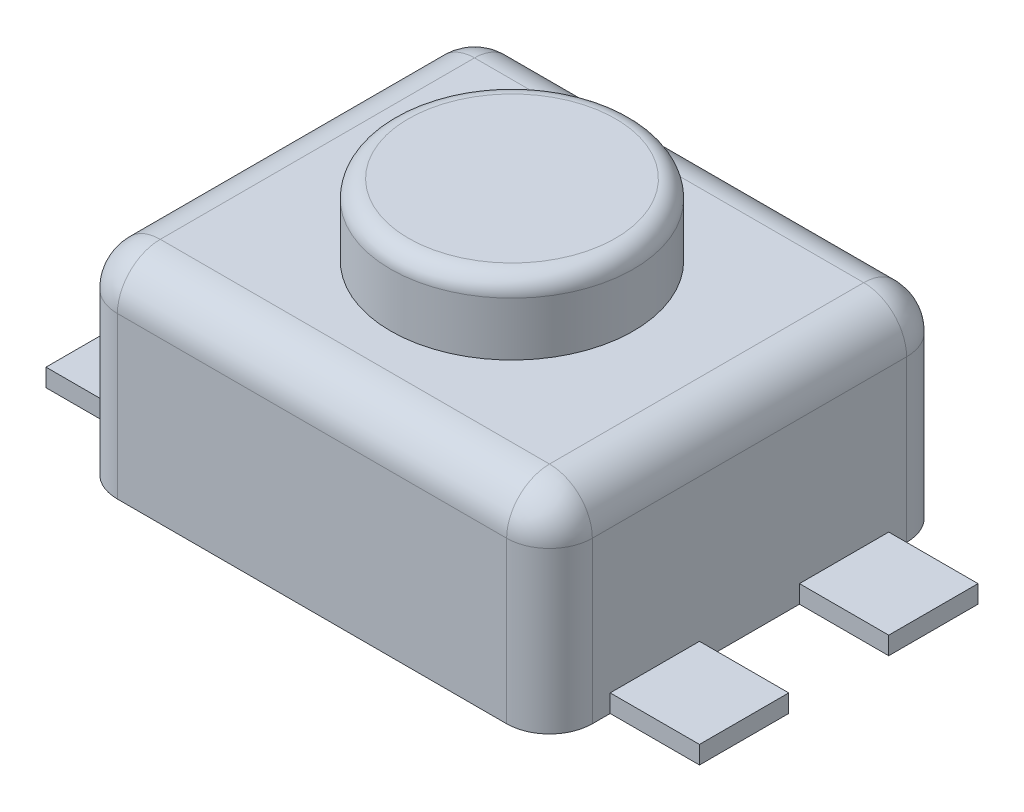
ISO-10303-21;
HEADER;
FILE_DESCRIPTION(('STEP AP214'),'2;1');
FILE_NAME('part.step','',(''),(''),'','','');
FILE_SCHEMA(('AUTOMOTIVE_DESIGN { 1 0 10303 214 1 1 1 1 }'));
ENDSEC;
DATA;
#1=APPLICATION_CONTEXT('core data for automotive mechanical design processes');
#2=APPLICATION_PROTOCOL_DEFINITION('international standard','automotive_design',2000,#1);
#3=PRODUCT_CONTEXT('',#1,'mechanical');
#4=PRODUCT('Part','Part','',(#3));
#5=PRODUCT_RELATED_PRODUCT_CATEGORY('part','',(#4));
#6=PRODUCT_DEFINITION_FORMATION('','',#4);
#7=PRODUCT_DEFINITION_CONTEXT('part definition',#1,'design');
#8=PRODUCT_DEFINITION('design','',#6,#7);
#9=PRODUCT_DEFINITION_SHAPE('','',#8);
#10=(LENGTH_UNIT() NAMED_UNIT(*) SI_UNIT(.MILLI.,.METRE.));
#11=(NAMED_UNIT(*) PLANE_ANGLE_UNIT() SI_UNIT($,.RADIAN.));
#12=(NAMED_UNIT(*) SI_UNIT($,.STERADIAN.) SOLID_ANGLE_UNIT());
#13=UNCERTAINTY_MEASURE_WITH_UNIT(LENGTH_MEASURE(1.E-05),#10,'distance_accuracy_value','');
#14=(GEOMETRIC_REPRESENTATION_CONTEXT(3) GLOBAL_UNCERTAINTY_ASSIGNED_CONTEXT((#13)) GLOBAL_UNIT_ASSIGNED_CONTEXT((#10,
#11,#12)) REPRESENTATION_CONTEXT('',''));
#15=CARTESIAN_POINT('',(0.,0.,0.));
#16=DIRECTION('',(0.,0.,1.));
#17=DIRECTION('',(1.,0.,0.));
#18=AXIS2_PLACEMENT_3D('',#15,#16,#17);
#19=CARTESIAN_POINT('',(-1.6891,1.4478,-1.4224));
#20=DIRECTION('',(1.,0.,0.));
#21=DIRECTION('',(0.,0.,-1.));
#22=AXIS2_PLACEMENT_3D('',#19,#20,#21);
#23=PLANE('',#22);
#24=DIRECTION('',(0.,-1.,0.));
#25=VECTOR('',#24,1.);
#26=CARTESIAN_POINT('',(-1.6891,0.127,0.3556));
#27=LINE('',#26,#25);
#28=CARTESIAN_POINT('',(-1.6891,0.127,0.3556));
#29=VERTEX_POINT('',#28);
#30=CARTESIAN_POINT('',(-1.6891,0.,0.3556));
#31=VERTEX_POINT('',#30);
#32=EDGE_CURVE('E298',#29,#31,#27,.T.);
#33=ORIENTED_EDGE('',*,*,#32,.F.);
#34=DIRECTION('',(0.,0.,-1.));
#35=VECTOR('',#34,1.);
#36=CARTESIAN_POINT('',(-1.6891,0.127,0.9906));
#37=LINE('',#36,#35);
#38=CARTESIAN_POINT('',(-1.6891,0.127,0.9906));
#39=VERTEX_POINT('',#38);
#40=EDGE_CURVE('E273',#39,#29,#37,.T.);
#41=ORIENTED_EDGE('',*,*,#40,.F.);
#42=DIRECTION('',(0.,-1.,0.));
#43=VECTOR('',#42,1.);
#44=CARTESIAN_POINT('',(-1.6891,0.127,0.9906));
#45=LINE('',#44,#43);
#46=CARTESIAN_POINT('',(-1.6891,0.,0.9906));
#47=VERTEX_POINT('',#46);
#48=EDGE_CURVE('E284',#39,#47,#45,.T.);
#49=ORIENTED_EDGE('',*,*,#48,.T.);
#50=DIRECTION('',(0.,0.,1.));
#51=VECTOR('',#50,1.);
#52=CARTESIAN_POINT('',(-1.6891,0.,-1.4224));
#53=LINE('',#52,#51);
#54=CARTESIAN_POINT('',(-1.6891,0.,1.1176));
#55=VERTEX_POINT('',#54);
#56=EDGE_CURVE('E341',#47,#55,#53,.T.);
#57=ORIENTED_EDGE('',*,*,#56,.T.);
#58=DIRECTION('',(0.,-1.,0.));
#59=VECTOR('',#58,1.);
#60=CARTESIAN_POINT('',(-1.6891,1.4478,1.1176));
#61=LINE('',#60,#59);
#62=CARTESIAN_POINT('',(-1.6891,1.143,1.1176));
#63=VERTEX_POINT('',#62);
#64=EDGE_CURVE('E368',#55,#63,#61,.F.);
#65=ORIENTED_EDGE('',*,*,#64,.T.);
#66=DIRECTION('',(0.,0.,1.));
#67=VECTOR('',#66,1.);
#68=CARTESIAN_POINT('',(-1.6891,1.143,-1.4224));
#69=LINE('',#68,#67);
#70=CARTESIAN_POINT('',(-1.6891,1.143,-1.1176));
#71=VERTEX_POINT('',#70);
#72=EDGE_CURVE('E366',#63,#71,#69,.F.);
#73=ORIENTED_EDGE('',*,*,#72,.T.);
#74=DIRECTION('',(0.,-1.,0.));
#75=VECTOR('',#74,1.);
#76=CARTESIAN_POINT('',(-1.6891,1.4478,-1.1176));
#77=LINE('',#76,#75);
#78=CARTESIAN_POINT('',(-1.6891,0.,-1.1176));
#79=VERTEX_POINT('',#78);
#80=EDGE_CURVE('E364',#71,#79,#77,.T.);
#81=ORIENTED_EDGE('',*,*,#80,.T.);
#82=CARTESIAN_POINT('',(-1.6891,0.,-0.9906));
#83=VERTEX_POINT('',#82);
#84=EDGE_CURVE('E342',#79,#83,#53,.T.);
#85=ORIENTED_EDGE('',*,*,#84,.T.);
#86=DIRECTION('',(0.,-1.,0.));
#87=VECTOR('',#86,1.);
#88=CARTESIAN_POINT('',(-1.6891,0.127,-0.9906));
#89=LINE('',#88,#87);
#90=CARTESIAN_POINT('',(-1.6891,0.127,-0.9906));
#91=VERTEX_POINT('',#90);
#92=EDGE_CURVE('E327',#91,#83,#89,.T.);
#93=ORIENTED_EDGE('',*,*,#92,.F.);
#94=DIRECTION('',(0.,0.,-1.));
#95=VECTOR('',#94,1.);
#96=CARTESIAN_POINT('',(-1.6891,0.127,-0.3556));
#97=LINE('',#96,#95);
#98=CARTESIAN_POINT('',(-1.6891,0.127,-0.3556));
#99=VERTEX_POINT('',#98);
#100=EDGE_CURVE('E302',#99,#91,#97,.T.);
#101=ORIENTED_EDGE('',*,*,#100,.F.);
#102=DIRECTION('',(0.,-1.,0.));
#103=VECTOR('',#102,1.);
#104=CARTESIAN_POINT('',(-1.6891,0.127,-0.3556));
#105=LINE('',#104,#103);
#106=CARTESIAN_POINT('',(-1.6891,0.,-0.3556));
#107=VERTEX_POINT('',#106);
#108=EDGE_CURVE('E313',#99,#107,#105,.T.);
#109=ORIENTED_EDGE('',*,*,#108,.T.);
#110=EDGE_CURVE('E345',#107,#31,#53,.T.);
#111=ORIENTED_EDGE('',*,*,#110,.T.);
#112=EDGE_LOOP('',(#33,#41,#49,#57,#65,#73,#81,#85,#93,#101,#109,#111));
#113=FACE_BOUND('',#112,.T.);
#114=ADVANCED_FACE('F35',(#113),#23,.F.);
#115=CARTESIAN_POINT('',(1.6891,1.4478,-1.4224));
#116=DIRECTION('',(-1.,0.,0.));
#117=DIRECTION('',(0.,0.,1.));
#118=AXIS2_PLACEMENT_3D('',#115,#116,#117);
#119=PLANE('',#118);
#120=DIRECTION('',(0.,0.,-1.));
#121=VECTOR('',#120,1.);
#122=CARTESIAN_POINT('',(1.6891,0.,-1.4224));
#123=LINE('',#122,#121);
#124=CARTESIAN_POINT('',(1.6891,0.,1.1176));
#125=VERTEX_POINT('',#124);
#126=CARTESIAN_POINT('',(1.6891,0.,0.9906));
#127=VERTEX_POINT('',#126);
#128=EDGE_CURVE('E334',#125,#127,#123,.T.);
#129=ORIENTED_EDGE('',*,*,#128,.T.);
#130=DIRECTION('',(0.,-1.,0.));
#131=VECTOR('',#130,1.);
#132=CARTESIAN_POINT('',(1.6891,0.127,0.9906));
#133=LINE('',#132,#131);
#134=CARTESIAN_POINT('',(1.6891,0.127,0.9906));
#135=VERTEX_POINT('',#134);
#136=EDGE_CURVE('E55',#135,#127,#133,.T.);
#137=ORIENTED_EDGE('',*,*,#136,.F.);
#138=DIRECTION('',(0.,0.,-1.));
#139=VECTOR('',#138,1.);
#140=CARTESIAN_POINT('',(1.6891,0.127,0.9906));
#141=LINE('',#140,#139);
#142=CARTESIAN_POINT('',(1.6891,0.127,0.3556));
#143=VERTEX_POINT('',#142);
#144=EDGE_CURVE('E50',#135,#143,#141,.T.);
#145=ORIENTED_EDGE('',*,*,#144,.T.);
#146=DIRECTION('',(0.,-1.,0.));
#147=VECTOR('',#146,1.);
#148=CARTESIAN_POINT('',(1.6891,0.127,0.3556));
#149=LINE('',#148,#147);
#150=CARTESIAN_POINT('',(1.6891,0.,0.3556));
#151=VERTEX_POINT('',#150);
#152=EDGE_CURVE('E229',#143,#151,#149,.T.);
#153=ORIENTED_EDGE('',*,*,#152,.T.);
#154=CARTESIAN_POINT('',(1.6891,0.,-0.3556));
#155=VERTEX_POINT('',#154);
#156=EDGE_CURVE('E337',#151,#155,#123,.T.);
#157=ORIENTED_EDGE('',*,*,#156,.T.);
#158=DIRECTION('',(0.,-1.,0.));
#159=VECTOR('',#158,1.);
#160=CARTESIAN_POINT('',(1.6891,0.127,-0.3556));
#161=LINE('',#160,#159);
#162=CARTESIAN_POINT('',(1.6891,0.127,-0.3556));
#163=VERTEX_POINT('',#162);
#164=EDGE_CURVE('E269',#163,#155,#161,.T.);
#165=ORIENTED_EDGE('',*,*,#164,.F.);
#166=DIRECTION('',(0.,0.,-1.));
#167=VECTOR('',#166,1.);
#168=CARTESIAN_POINT('',(1.6891,0.127,-0.3556));
#169=LINE('',#168,#167);
#170=CARTESIAN_POINT('',(1.6891,0.127,-0.9906));
#171=VERTEX_POINT('',#170);
#172=EDGE_CURVE('E243',#163,#171,#169,.T.);
#173=ORIENTED_EDGE('',*,*,#172,.T.);
#174=DIRECTION('',(0.,-1.,0.));
#175=VECTOR('',#174,1.);
#176=CARTESIAN_POINT('',(1.6891,0.127,-0.9906));
#177=LINE('',#176,#175);
#178=CARTESIAN_POINT('',(1.6891,0.,-0.9906));
#179=VERTEX_POINT('',#178);
#180=EDGE_CURVE('E255',#171,#179,#177,.T.);
#181=ORIENTED_EDGE('',*,*,#180,.T.);
#182=CARTESIAN_POINT('',(1.6891,0.,-1.1176));
#183=VERTEX_POINT('',#182);
#184=EDGE_CURVE('E338',#179,#183,#123,.T.);
#185=ORIENTED_EDGE('',*,*,#184,.T.);
#186=DIRECTION('',(0.,-1.,0.));
#187=VECTOR('',#186,1.);
#188=CARTESIAN_POINT('',(1.6891,1.4478,-1.1176));
#189=LINE('',#188,#187);
#190=CARTESIAN_POINT('',(1.6891,1.143,-1.1176));
#191=VERTEX_POINT('',#190);
#192=EDGE_CURVE('E380',#183,#191,#189,.F.);
#193=ORIENTED_EDGE('',*,*,#192,.T.);
#194=DIRECTION('',(0.,0.,-1.));
#195=VECTOR('',#194,1.);
#196=CARTESIAN_POINT('',(1.6891,1.143,1.4224));
#197=LINE('',#196,#195);
#198=CARTESIAN_POINT('',(1.6891,1.143,1.1176));
#199=VERTEX_POINT('',#198);
#200=EDGE_CURVE('E378',#191,#199,#197,.F.);
#201=ORIENTED_EDGE('',*,*,#200,.T.);
#202=DIRECTION('',(0.,-1.,0.));
#203=VECTOR('',#202,1.);
#204=CARTESIAN_POINT('',(1.6891,1.4478,1.1176));
#205=LINE('',#204,#203);
#206=EDGE_CURVE('E376',#199,#125,#205,.T.);
#207=ORIENTED_EDGE('',*,*,#206,.T.);
#208=EDGE_LOOP('',(#129,#137,#145,#153,#157,#165,#173,#181,#185,#193,#201,#207));
#209=FACE_BOUND('',#208,.T.);
#210=ADVANCED_FACE('F443',(#209),#119,.F.);
#211=CARTESIAN_POINT('',(-1.6891,1.4478,-1.4224));
#212=DIRECTION('',(0.,0.,1.));
#213=DIRECTION('',(1.,0.,0.));
#214=AXIS2_PLACEMENT_3D('',#211,#212,#213);
#215=PLANE('',#214);
#216=DIRECTION('',(-1.,0.,0.));
#217=VECTOR('',#216,1.);
#218=CARTESIAN_POINT('',(-1.6891,0.,-1.4224));
#219=LINE('',#218,#217);
#220=CARTESIAN_POINT('',(1.3843,0.,-1.4224));
#221=VERTEX_POINT('',#220);
#222=CARTESIAN_POINT('',(-1.3843,0.,-1.4224));
#223=VERTEX_POINT('',#222);
#224=EDGE_CURVE('E336',#221,#223,#219,.T.);
#225=ORIENTED_EDGE('',*,*,#224,.T.);
#226=DIRECTION('',(0.,-1.,0.));
#227=VECTOR('',#226,1.);
#228=CARTESIAN_POINT('',(-1.3843,1.4478,-1.4224));
#229=LINE('',#228,#227);
#230=CARTESIAN_POINT('',(-1.3843,1.143,-1.4224));
#231=VERTEX_POINT('',#230);
#232=EDGE_CURVE('E374',#223,#231,#229,.F.);
#233=ORIENTED_EDGE('',*,*,#232,.T.);
#234=DIRECTION('',(-1.,0.,0.));
#235=VECTOR('',#234,1.);
#236=CARTESIAN_POINT('',(1.6891,1.143,-1.4224));
#237=LINE('',#236,#235);
#238=CARTESIAN_POINT('',(1.3843,1.143,-1.4224));
#239=VERTEX_POINT('',#238);
#240=EDGE_CURVE('E372',#231,#239,#237,.F.);
#241=ORIENTED_EDGE('',*,*,#240,.T.);
#242=DIRECTION('',(0.,-1.,0.));
#243=VECTOR('',#242,1.);
#244=CARTESIAN_POINT('',(1.3843,1.4478,-1.4224));
#245=LINE('',#244,#243);
#246=EDGE_CURVE('E370',#239,#221,#245,.T.);
#247=ORIENTED_EDGE('',*,*,#246,.T.);
#248=EDGE_LOOP('',(#225,#233,#241,#247));
#249=FACE_BOUND('',#248,.T.);
#250=ADVANCED_FACE('F449',(#249),#215,.F.);
#251=CARTESIAN_POINT('',(-1.6891,1.4478,1.4224));
#252=DIRECTION('',(0.,0.,-1.));
#253=DIRECTION('',(-1.,0.,0.));
#254=AXIS2_PLACEMENT_3D('',#251,#252,#253);
#255=PLANE('',#254);
#256=DIRECTION('',(1.,0.,0.));
#257=VECTOR('',#256,1.);
#258=CARTESIAN_POINT('',(-1.6891,1.143,1.4224));
#259=LINE('',#258,#257);
#260=CARTESIAN_POINT('',(1.3843,1.143,1.4224));
#261=VERTEX_POINT('',#260);
#262=CARTESIAN_POINT('',(-1.3843,1.143,1.4224));
#263=VERTEX_POINT('',#262);
#264=EDGE_CURVE('E359',#261,#263,#259,.F.);
#265=ORIENTED_EDGE('',*,*,#264,.T.);
#266=DIRECTION('',(0.,-1.,0.));
#267=VECTOR('',#266,1.);
#268=CARTESIAN_POINT('',(-1.3843,1.4478,1.4224));
#269=LINE('',#268,#267);
#270=CARTESIAN_POINT('',(-1.3843,0.,1.4224));
#271=VERTEX_POINT('',#270);
#272=EDGE_CURVE('E362',#263,#271,#269,.T.);
#273=ORIENTED_EDGE('',*,*,#272,.T.);
#274=DIRECTION('',(1.,0.,0.));
#275=VECTOR('',#274,1.);
#276=CARTESIAN_POINT('',(-1.6891,0.,1.4224));
#277=LINE('',#276,#275);
#278=CARTESIAN_POINT('',(1.3843,0.,1.4224));
#279=VERTEX_POINT('',#278);
#280=EDGE_CURVE('E344',#271,#279,#277,.T.);
#281=ORIENTED_EDGE('',*,*,#280,.T.);
#282=DIRECTION('',(0.,-1.,0.));
#283=VECTOR('',#282,1.);
#284=CARTESIAN_POINT('',(1.3843,1.4478,1.4224));
#285=LINE('',#284,#283);
#286=EDGE_CURVE('E357',#279,#261,#285,.F.);
#287=ORIENTED_EDGE('',*,*,#286,.T.);
#288=EDGE_LOOP('',(#265,#273,#281,#287));
#289=FACE_BOUND('',#288,.T.);
#290=ADVANCED_FACE('F453',(#289),#255,.F.);
#291=CARTESIAN_POINT('',(0.,1.4478,0.));
#292=DIRECTION('',(0.,1.,0.));
#293=DIRECTION('',(0.,0.,1.));
#294=AXIS2_PLACEMENT_3D('',#291,#292,#293);
#295=PLANE('',#294);
#296=CARTESIAN_POINT('',(0.,1.4478,0.));
#297=DIRECTION('',(0.,1.,0.));
#298=DIRECTION('',(0.,0.,1.));
#299=AXIS2_PLACEMENT_3D('',#296,#297,#298);
#300=CIRCLE('',#299,0.8636);
#301=CARTESIAN_POINT('',(0.,1.4478,0.8636));
#302=VERTEX_POINT('',#301);
#303=EDGE_CURVE('E330',#302,#302,#300,.T.);
#304=ORIENTED_EDGE('',*,*,#303,.F.);
#305=EDGE_LOOP('',(#304));
#306=FACE_BOUND('',#305,.T.);
#307=DIRECTION('',(0.,0.,1.));
#308=VECTOR('',#307,1.);
#309=CARTESIAN_POINT('',(-1.3843,1.4478,1.4224));
#310=LINE('',#309,#308);
#311=CARTESIAN_POINT('',(-1.3843,1.4478,-1.1176));
#312=VERTEX_POINT('',#311);
#313=CARTESIAN_POINT('',(-1.3843,1.4478,1.1176));
#314=VERTEX_POINT('',#313);
#315=EDGE_CURVE('E352',#312,#314,#310,.T.);
#316=ORIENTED_EDGE('',*,*,#315,.T.);
#317=DIRECTION('',(1.,0.,0.));
#318=VECTOR('',#317,1.);
#319=CARTESIAN_POINT('',(1.6891,1.4478,1.1176));
#320=LINE('',#319,#318);
#321=CARTESIAN_POINT('',(1.3843,1.4478,1.1176));
#322=VERTEX_POINT('',#321);
#323=EDGE_CURVE('E354',#314,#322,#320,.T.);
#324=ORIENTED_EDGE('',*,*,#323,.T.);
#325=DIRECTION('',(0.,0.,-1.));
#326=VECTOR('',#325,1.);
#327=CARTESIAN_POINT('',(1.3843,1.4478,-1.4224));
#328=LINE('',#327,#326);
#329=CARTESIAN_POINT('',(1.3843,1.4478,-1.1176));
#330=VERTEX_POINT('',#329);
#331=EDGE_CURVE('E348',#322,#330,#328,.T.);
#332=ORIENTED_EDGE('',*,*,#331,.T.);
#333=DIRECTION('',(-1.,0.,0.));
#334=VECTOR('',#333,1.);
#335=CARTESIAN_POINT('',(-1.6891,1.4478,-1.1176));
#336=LINE('',#335,#334);
#337=EDGE_CURVE('E350',#330,#312,#336,.T.);
#338=ORIENTED_EDGE('',*,*,#337,.T.);
#339=EDGE_LOOP('',(#316,#324,#332,#338));
#340=FACE_BOUND('',#339,.T.);
#341=ADVANCED_FACE('F508',(#306,#340),#295,.T.);
#342=CARTESIAN_POINT('',(0.,0.,0.));
#343=DIRECTION('',(0.,1.,0.));
#344=DIRECTION('',(0.,0.,1.));
#345=AXIS2_PLACEMENT_3D('',#342,#343,#344);
#346=PLANE('',#345);
#347=ORIENTED_EDGE('',*,*,#280,.F.);
#348=CARTESIAN_POINT('',(-1.3843,0.,1.1176));
#349=DIRECTION('',(0.,1.,0.));
#350=DIRECTION('',(0.,0.,1.));
#351=AXIS2_PLACEMENT_3D('',#348,#349,#350);
#352=CIRCLE('',#351,0.3048);
#353=EDGE_CURVE('E389',#271,#55,#352,.F.);
#354=ORIENTED_EDGE('',*,*,#353,.T.);
#355=ORIENTED_EDGE('',*,*,#56,.F.);
#356=DIRECTION('',(1.,0.,0.));
#357=VECTOR('',#356,1.);
#358=CARTESIAN_POINT('',(-1.6891,0.,0.9906));
#359=LINE('',#358,#357);
#360=CARTESIAN_POINT('',(-2.3241,0.,0.9906));
#361=VERTEX_POINT('',#360);
#362=EDGE_CURVE('E277',#361,#47,#359,.T.);
#363=ORIENTED_EDGE('',*,*,#362,.F.);
#364=DIRECTION('',(0.,0.,1.));
#365=VECTOR('',#364,1.);
#366=CARTESIAN_POINT('',(-2.3241,0.,0.9906));
#367=LINE('',#366,#365);
#368=CARTESIAN_POINT('',(-2.3241,0.,0.3556));
#369=VERTEX_POINT('',#368);
#370=EDGE_CURVE('E286',#369,#361,#367,.T.);
#371=ORIENTED_EDGE('',*,*,#370,.F.);
#372=DIRECTION('',(-1.,0.,0.));
#373=VECTOR('',#372,1.);
#374=CARTESIAN_POINT('',(-1.6891,0.,0.3556));
#375=LINE('',#374,#373);
#376=EDGE_CURVE('E272',#31,#369,#375,.T.);
#377=ORIENTED_EDGE('',*,*,#376,.F.);
#378=ORIENTED_EDGE('',*,*,#110,.F.);
#379=DIRECTION('',(1.,0.,0.));
#380=VECTOR('',#379,1.);
#381=CARTESIAN_POINT('',(-1.6891,0.,-0.3556));
#382=LINE('',#381,#380);
#383=CARTESIAN_POINT('',(-2.3241,0.,-0.3556));
#384=VERTEX_POINT('',#383);
#385=EDGE_CURVE('E306',#384,#107,#382,.T.);
#386=ORIENTED_EDGE('',*,*,#385,.F.);
#387=DIRECTION('',(0.,0.,1.));
#388=VECTOR('',#387,1.);
#389=CARTESIAN_POINT('',(-2.3241,0.,-0.3556));
#390=LINE('',#389,#388);
#391=CARTESIAN_POINT('',(-2.3241,0.,-0.9906));
#392=VERTEX_POINT('',#391);
#393=EDGE_CURVE('E315',#392,#384,#390,.T.);
#394=ORIENTED_EDGE('',*,*,#393,.F.);
#395=DIRECTION('',(-1.,0.,0.));
#396=VECTOR('',#395,1.);
#397=CARTESIAN_POINT('',(-1.6891,0.,-0.9906));
#398=LINE('',#397,#396);
#399=EDGE_CURVE('E301',#83,#392,#398,.T.);
#400=ORIENTED_EDGE('',*,*,#399,.F.);
#401=ORIENTED_EDGE('',*,*,#84,.F.);
#402=CARTESIAN_POINT('',(-1.3843,0.,-1.1176));
#403=DIRECTION('',(0.,1.,0.));
#404=DIRECTION('',(0.,0.,1.));
#405=AXIS2_PLACEMENT_3D('',#402,#403,#404);
#406=CIRCLE('',#405,0.3048);
#407=EDGE_CURVE('E387',#79,#223,#406,.F.);
#408=ORIENTED_EDGE('',*,*,#407,.T.);
#409=ORIENTED_EDGE('',*,*,#224,.F.);
#410=CARTESIAN_POINT('',(1.3843,0.,-1.1176));
#411=DIRECTION('',(0.,1.,0.));
#412=DIRECTION('',(0.,0.,1.));
#413=AXIS2_PLACEMENT_3D('',#410,#411,#412);
#414=CIRCLE('',#413,0.3048);
#415=EDGE_CURVE('E384',#221,#183,#414,.F.);
#416=ORIENTED_EDGE('',*,*,#415,.T.);
#417=ORIENTED_EDGE('',*,*,#184,.F.);
#418=DIRECTION('',(1.,0.,0.));
#419=VECTOR('',#418,1.);
#420=CARTESIAN_POINT('',(1.6891,0.,-0.9906));
#421=LINE('',#420,#419);
#422=CARTESIAN_POINT('',(2.3241,0.,-0.9906));
#423=VERTEX_POINT('',#422);
#424=EDGE_CURVE('E246',#179,#423,#421,.T.);
#425=ORIENTED_EDGE('',*,*,#424,.T.);
#426=DIRECTION('',(0.,0.,1.));
#427=VECTOR('',#426,1.);
#428=CARTESIAN_POINT('',(2.3241,0.,-0.3556));
#429=LINE('',#428,#427);
#430=CARTESIAN_POINT('',(2.3241,0.,-0.3556));
#431=VERTEX_POINT('',#430);
#432=EDGE_CURVE('E258',#423,#431,#429,.T.);
#433=ORIENTED_EDGE('',*,*,#432,.T.);
#434=DIRECTION('',(-1.,0.,0.));
#435=VECTOR('',#434,1.);
#436=CARTESIAN_POINT('',(1.6891,0.,-0.3556));
#437=LINE('',#436,#435);
#438=EDGE_CURVE('E242',#431,#155,#437,.T.);
#439=ORIENTED_EDGE('',*,*,#438,.T.);
#440=ORIENTED_EDGE('',*,*,#156,.F.);
#441=DIRECTION('',(1.,0.,0.));
#442=VECTOR('',#441,1.);
#443=CARTESIAN_POINT('',(1.6891,0.,0.3556));
#444=LINE('',#443,#442);
#445=CARTESIAN_POINT('',(2.3241,0.,0.3556));
#446=VERTEX_POINT('',#445);
#447=EDGE_CURVE('E236',#151,#446,#444,.T.);
#448=ORIENTED_EDGE('',*,*,#447,.T.);
#449=DIRECTION('',(0.,0.,1.));
#450=VECTOR('',#449,1.);
#451=CARTESIAN_POINT('',(2.3241,0.,0.9906));
#452=LINE('',#451,#450);
#453=CARTESIAN_POINT('',(2.3241,0.,0.9906));
#454=VERTEX_POINT('',#453);
#455=EDGE_CURVE('E234',#446,#454,#452,.T.);
#456=ORIENTED_EDGE('',*,*,#455,.T.);
#457=DIRECTION('',(-1.,0.,0.));
#458=VECTOR('',#457,1.);
#459=CARTESIAN_POINT('',(1.6891,0.,0.9906));
#460=LINE('',#459,#458);
#461=EDGE_CURVE('E212',#454,#127,#460,.T.);
#462=ORIENTED_EDGE('',*,*,#461,.T.);
#463=ORIENTED_EDGE('',*,*,#128,.F.);
#464=CARTESIAN_POINT('',(1.3843,0.,1.1176));
#465=DIRECTION('',(0.,1.,0.));
#466=DIRECTION('',(0.,0.,1.));
#467=AXIS2_PLACEMENT_3D('',#464,#465,#466);
#468=CIRCLE('',#467,0.3048);
#469=EDGE_CURVE('E382',#125,#279,#468,.F.);
#470=ORIENTED_EDGE('',*,*,#469,.T.);
#471=EDGE_LOOP('',(#347,#354,#355,#363,#371,#377,#378,#386,#394,#400,#401,#408,#409,#416,#417,
#425,#433,#439,#440,#448,#456,#462,#463,#470));
#472=FACE_BOUND('',#471,.T.);
#473=ADVANCED_FACE('F503',(#472),#346,.F.);
#474=CARTESIAN_POINT('',(-1.3843,1.4478,-1.1176));
#475=DIRECTION('',(0.,-1.,0.));
#476=DIRECTION('',(0.,0.,-1.));
#477=AXIS2_PLACEMENT_3D('',#474,#475,#476);
#478=CYLINDRICAL_SURFACE('',#477,0.3048);
#479=ORIENTED_EDGE('',*,*,#407,.F.);
#480=ORIENTED_EDGE('',*,*,#80,.F.);
#481=CARTESIAN_POINT('',(-1.3843,1.143,-1.1176));
#482=DIRECTION('',(0.,1.,0.));
#483=DIRECTION('',(0.,0.,1.));
#484=AXIS2_PLACEMENT_3D('',#481,#482,#483);
#485=CIRCLE('',#484,0.3048);
#486=EDGE_CURVE('E422',#231,#71,#485,.T.);
#487=ORIENTED_EDGE('',*,*,#486,.F.);
#488=ORIENTED_EDGE('',*,*,#232,.F.);
#489=EDGE_LOOP('',(#479,#480,#487,#488));
#490=FACE_BOUND('',#489,.T.);
#491=ADVANCED_FACE('F500',(#490),#478,.T.);
#492=CARTESIAN_POINT('',(0.,1.143,-1.1176));
#493=DIRECTION('',(1.,0.,0.));
#494=DIRECTION('',(0.,0.,-1.));
#495=AXIS2_PLACEMENT_3D('',#492,#493,#494);
#496=CYLINDRICAL_SURFACE('',#495,0.3048);
#497=CARTESIAN_POINT('',(1.3843,1.143,-1.1176));
#498=DIRECTION('',(1.,0.,0.));
#499=DIRECTION('',(0.,0.,-1.));
#500=AXIS2_PLACEMENT_3D('',#497,#498,#499);
#501=CIRCLE('',#500,0.3048);
#502=EDGE_CURVE('E416',#239,#330,#501,.T.);
#503=ORIENTED_EDGE('',*,*,#502,.F.);
#504=ORIENTED_EDGE('',*,*,#240,.F.);
#505=CARTESIAN_POINT('',(-1.3843,1.143,-1.1176));
#506=DIRECTION('',(-1.,0.,0.));
#507=DIRECTION('',(0.,0.,1.));
#508=AXIS2_PLACEMENT_3D('',#505,#506,#507);
#509=CIRCLE('',#508,0.3048);
#510=EDGE_CURVE('E419',#312,#231,#509,.T.);
#511=ORIENTED_EDGE('',*,*,#510,.F.);
#512=ORIENTED_EDGE('',*,*,#337,.F.);
#513=EDGE_LOOP('',(#503,#504,#511,#512));
#514=FACE_BOUND('',#513,.T.);
#515=ADVANCED_FACE('F497',(#514),#496,.T.);
#516=CARTESIAN_POINT('',(1.3843,1.4478,-1.1176));
#517=DIRECTION('',(0.,-1.,0.));
#518=DIRECTION('',(0.,0.,-1.));
#519=AXIS2_PLACEMENT_3D('',#516,#517,#518);
#520=CYLINDRICAL_SURFACE('',#519,0.3048);
#521=ORIENTED_EDGE('',*,*,#415,.F.);
#522=ORIENTED_EDGE('',*,*,#246,.F.);
#523=CARTESIAN_POINT('',(1.3843,1.143,-1.1176));
#524=DIRECTION('',(0.,1.,0.));
#525=DIRECTION('',(0.,0.,1.));
#526=AXIS2_PLACEMENT_3D('',#523,#524,#525);
#527=CIRCLE('',#526,0.3048);
#528=EDGE_CURVE('E413',#191,#239,#527,.T.);
#529=ORIENTED_EDGE('',*,*,#528,.F.);
#530=ORIENTED_EDGE('',*,*,#192,.F.);
#531=EDGE_LOOP('',(#521,#522,#529,#530));
#532=FACE_BOUND('',#531,.T.);
#533=ADVANCED_FACE('F493',(#532),#520,.T.);
#534=CARTESIAN_POINT('',(-1.3843,1.143,-1.1176));
#535=DIRECTION('',(0.,0.,1.));
#536=DIRECTION('',(1.,0.,0.));
#537=AXIS2_PLACEMENT_3D('',#534,#535,#536);
#538=SPHERICAL_SURFACE('',#537,0.3048);
#539=ORIENTED_EDGE('',*,*,#510,.T.);
#540=ORIENTED_EDGE('',*,*,#486,.T.);
#541=CARTESIAN_POINT('',(-1.3843,1.143,-1.1176));
#542=DIRECTION('',(0.,0.,-1.));
#543=DIRECTION('',(-1.,0.,0.));
#544=AXIS2_PLACEMENT_3D('',#541,#542,#543);
#545=CIRCLE('',#544,0.3048);
#546=EDGE_CURVE('E410',#312,#71,#545,.F.);
#547=ORIENTED_EDGE('',*,*,#546,.F.);
#548=EDGE_LOOP('',(#539,#540,#547));
#549=FACE_BOUND('',#548,.T.);
#550=ADVANCED_FACE('F489',(#549),#538,.T.);
#551=CARTESIAN_POINT('',(1.3843,1.143,-1.1176));
#552=DIRECTION('',(0.,0.,1.));
#553=DIRECTION('',(1.,0.,0.));
#554=AXIS2_PLACEMENT_3D('',#551,#552,#553);
#555=SPHERICAL_SURFACE('',#554,0.3048);
#556=ORIENTED_EDGE('',*,*,#528,.T.);
#557=ORIENTED_EDGE('',*,*,#502,.T.);
#558=CARTESIAN_POINT('',(1.3843,1.143,-1.1176));
#559=DIRECTION('',(0.,0.,-1.));
#560=DIRECTION('',(-1.,0.,0.));
#561=AXIS2_PLACEMENT_3D('',#558,#559,#560);
#562=CIRCLE('',#561,0.3048);
#563=EDGE_CURVE('E407',#191,#330,#562,.F.);
#564=ORIENTED_EDGE('',*,*,#563,.F.);
#565=EDGE_LOOP('',(#556,#557,#564));
#566=FACE_BOUND('',#565,.T.);
#567=ADVANCED_FACE('F485',(#566),#555,.T.);
#568=CARTESIAN_POINT('',(-1.3843,1.4478,1.1176));
#569=DIRECTION('',(0.,-1.,0.));
#570=DIRECTION('',(0.,0.,-1.));
#571=AXIS2_PLACEMENT_3D('',#568,#569,#570);
#572=CYLINDRICAL_SURFACE('',#571,0.3048);
#573=ORIENTED_EDGE('',*,*,#353,.F.);
#574=ORIENTED_EDGE('',*,*,#272,.F.);
#575=CARTESIAN_POINT('',(-1.3843,1.143,1.1176));
#576=DIRECTION('',(0.,1.,0.));
#577=DIRECTION('',(0.,0.,1.));
#578=AXIS2_PLACEMENT_3D('',#575,#576,#577);
#579=CIRCLE('',#578,0.3048);
#580=EDGE_CURVE('E404',#63,#263,#579,.T.);
#581=ORIENTED_EDGE('',*,*,#580,.F.);
#582=ORIENTED_EDGE('',*,*,#64,.F.);
#583=EDGE_LOOP('',(#573,#574,#581,#582));
#584=FACE_BOUND('',#583,.T.);
#585=ADVANCED_FACE('F481',(#584),#572,.T.);
#586=CARTESIAN_POINT('',(-1.3843,1.143,0.));
#587=DIRECTION('',(0.,0.,-1.));
#588=DIRECTION('',(-1.,0.,0.));
#589=AXIS2_PLACEMENT_3D('',#586,#587,#588);
#590=CYLINDRICAL_SURFACE('',#589,0.3048);
#591=ORIENTED_EDGE('',*,*,#546,.T.);
#592=ORIENTED_EDGE('',*,*,#72,.F.);
#593=CARTESIAN_POINT('',(-1.3843,1.143,1.1176));
#594=DIRECTION('',(0.,0.,1.));
#595=DIRECTION('',(1.,0.,0.));
#596=AXIS2_PLACEMENT_3D('',#593,#594,#595);
#597=CIRCLE('',#596,0.3048);
#598=EDGE_CURVE('E401',#314,#63,#597,.T.);
#599=ORIENTED_EDGE('',*,*,#598,.F.);
#600=ORIENTED_EDGE('',*,*,#315,.F.);
#601=EDGE_LOOP('',(#591,#592,#599,#600));
#602=FACE_BOUND('',#601,.T.);
#603=ADVANCED_FACE('F477',(#602),#590,.T.);
#604=CARTESIAN_POINT('',(1.3843,1.143,0.));
#605=DIRECTION('',(0.,0.,1.));
#606=DIRECTION('',(1.,0.,0.));
#607=AXIS2_PLACEMENT_3D('',#604,#605,#606);
#608=CYLINDRICAL_SURFACE('',#607,0.3048);
#609=ORIENTED_EDGE('',*,*,#563,.T.);
#610=ORIENTED_EDGE('',*,*,#331,.F.);
#611=CARTESIAN_POINT('',(1.3843,1.143,1.1176));
#612=DIRECTION('',(0.,0.,1.));
#613=DIRECTION('',(1.,0.,0.));
#614=AXIS2_PLACEMENT_3D('',#611,#612,#613);
#615=CIRCLE('',#614,0.3048);
#616=EDGE_CURVE('E398',#199,#322,#615,.T.);
#617=ORIENTED_EDGE('',*,*,#616,.F.);
#618=ORIENTED_EDGE('',*,*,#200,.F.);
#619=EDGE_LOOP('',(#609,#610,#617,#618));
#620=FACE_BOUND('',#619,.T.);
#621=ADVANCED_FACE('F473',(#620),#608,.T.);
#622=CARTESIAN_POINT('',(1.3843,1.4478,1.1176));
#623=DIRECTION('',(0.,-1.,0.));
#624=DIRECTION('',(0.,0.,-1.));
#625=AXIS2_PLACEMENT_3D('',#622,#623,#624);
#626=CYLINDRICAL_SURFACE('',#625,0.3048);
#627=ORIENTED_EDGE('',*,*,#469,.F.);
#628=ORIENTED_EDGE('',*,*,#206,.F.);
#629=CARTESIAN_POINT('',(1.3843,1.143,1.1176));
#630=DIRECTION('',(0.,1.,0.));
#631=DIRECTION('',(0.,0.,1.));
#632=AXIS2_PLACEMENT_3D('',#629,#630,#631);
#633=CIRCLE('',#632,0.3048);
#634=EDGE_CURVE('E395',#261,#199,#633,.T.);
#635=ORIENTED_EDGE('',*,*,#634,.F.);
#636=ORIENTED_EDGE('',*,*,#286,.F.);
#637=EDGE_LOOP('',(#627,#628,#635,#636));
#638=FACE_BOUND('',#637,.T.);
#639=ADVANCED_FACE('F469',(#638),#626,.T.);
#640=CARTESIAN_POINT('',(-1.3843,1.143,1.1176));
#641=DIRECTION('',(0.,0.,1.));
#642=DIRECTION('',(1.,0.,0.));
#643=AXIS2_PLACEMENT_3D('',#640,#641,#642);
#644=SPHERICAL_SURFACE('',#643,0.3048);
#645=ORIENTED_EDGE('',*,*,#598,.T.);
#646=ORIENTED_EDGE('',*,*,#580,.T.);
#647=CARTESIAN_POINT('',(-1.3843,1.143,1.1176));
#648=DIRECTION('',(-1.,0.,0.));
#649=DIRECTION('',(0.,0.,1.));
#650=AXIS2_PLACEMENT_3D('',#647,#648,#649);
#651=CIRCLE('',#650,0.3048);
#652=EDGE_CURVE('E393',#314,#263,#651,.F.);
#653=ORIENTED_EDGE('',*,*,#652,.F.);
#654=EDGE_LOOP('',(#645,#646,#653));
#655=FACE_BOUND('',#654,.T.);
#656=ADVANCED_FACE('F465',(#655),#644,.T.);
#657=CARTESIAN_POINT('',(1.3843,1.143,1.1176));
#658=DIRECTION('',(0.,0.,1.));
#659=DIRECTION('',(1.,0.,0.));
#660=AXIS2_PLACEMENT_3D('',#657,#658,#659);
#661=SPHERICAL_SURFACE('',#660,0.3048);
#662=ORIENTED_EDGE('',*,*,#634,.T.);
#663=ORIENTED_EDGE('',*,*,#616,.T.);
#664=CARTESIAN_POINT('',(1.3843,1.143,1.1176));
#665=DIRECTION('',(1.,0.,0.));
#666=DIRECTION('',(0.,0.,-1.));
#667=AXIS2_PLACEMENT_3D('',#664,#665,#666);
#668=CIRCLE('',#667,0.3048);
#669=EDGE_CURVE('E333',#261,#322,#668,.F.);
#670=ORIENTED_EDGE('',*,*,#669,.F.);
#671=EDGE_LOOP('',(#662,#663,#670));
#672=FACE_BOUND('',#671,.T.);
#673=ADVANCED_FACE('F461',(#672),#661,.T.);
#674=CARTESIAN_POINT('',(0.,1.143,1.1176));
#675=DIRECTION('',(-1.,0.,0.));
#676=DIRECTION('',(0.,0.,1.));
#677=AXIS2_PLACEMENT_3D('',#674,#675,#676);
#678=CYLINDRICAL_SURFACE('',#677,0.3048);
#679=ORIENTED_EDGE('',*,*,#652,.T.);
#680=ORIENTED_EDGE('',*,*,#264,.F.);
#681=ORIENTED_EDGE('',*,*,#669,.T.);
#682=ORIENTED_EDGE('',*,*,#323,.F.);
#683=EDGE_LOOP('',(#679,#680,#681,#682));
#684=FACE_BOUND('',#683,.T.);
#685=ADVANCED_FACE('F458',(#684),#678,.T.);
#686=CARTESIAN_POINT('',(0.,1.9558,0.));
#687=DIRECTION('',(0.,-1.,0.));
#688=DIRECTION('',(0.,0.,-1.));
#689=AXIS2_PLACEMENT_3D('',#686,#687,#688);
#690=CYLINDRICAL_SURFACE('',#689,0.8636);
#691=CARTESIAN_POINT('',(0.,1.8288,0.));
#692=DIRECTION('',(0.,1.,0.));
#693=DIRECTION('',(0.,0.,1.));
#694=AXIS2_PLACEMENT_3D('',#691,#692,#693);
#695=CIRCLE('',#694,0.8636);
#696=CARTESIAN_POINT('',(0.,1.8288,0.8636));
#697=VERTEX_POINT('',#696);
#698=EDGE_CURVE('E11',#697,#697,#695,.F.);
#699=ORIENTED_EDGE('',*,*,#698,.T.);
#700=EDGE_LOOP('',(#699));
#701=FACE_BOUND('',#700,.T.);
#702=ORIENTED_EDGE('',*,*,#303,.T.);
#703=EDGE_LOOP('',(#702));
#704=FACE_BOUND('',#703,.T.);
#705=ADVANCED_FACE('F439',(#701,#704),#690,.T.);
#706=CARTESIAN_POINT('',(0.,1.9558,0.));
#707=DIRECTION('',(0.,1.,0.));
#708=DIRECTION('',(0.,0.,1.));
#709=AXIS2_PLACEMENT_3D('',#706,#707,#708);
#710=PLANE('',#709);
#711=CARTESIAN_POINT('',(0.,1.9558,0.));
#712=DIRECTION('',(0.,1.,0.));
#713=DIRECTION('',(0.,0.,1.));
#714=AXIS2_PLACEMENT_3D('',#711,#712,#713);
#715=CIRCLE('',#714,0.7366);
#716=CARTESIAN_POINT('',(0.,1.9558,0.7366));
#717=VERTEX_POINT('',#716);
#718=EDGE_CURVE('E43',#717,#717,#715,.T.);
#719=ORIENTED_EDGE('',*,*,#718,.T.);
#720=EDGE_LOOP('',(#719));
#721=FACE_BOUND('',#720,.T.);
#722=ADVANCED_FACE('F427',(#721),#710,.T.);
#723=CARTESIAN_POINT('',(0.,1.8288,0.));
#724=DIRECTION('',(0.,1.,0.));
#725=DIRECTION('',(0.,0.,1.));
#726=AXIS2_PLACEMENT_3D('',#723,#724,#725);
#727=TOROIDAL_SURFACE('',#726,0.7366,0.127);
#728=ORIENTED_EDGE('',*,*,#698,.F.);
#729=EDGE_LOOP('',(#728));
#730=FACE_BOUND('',#729,.T.);
#731=ORIENTED_EDGE('',*,*,#718,.F.);
#732=EDGE_LOOP('',(#731));
#733=FACE_BOUND('',#732,.T.);
#734=ADVANCED_FACE('F37',(#730,#733),#727,.T.);
#735=CARTESIAN_POINT('',(-1.6891,0.127,-0.9906));
#736=DIRECTION('',(0.,0.,1.));
#737=DIRECTION('',(1.,0.,0.));
#738=AXIS2_PLACEMENT_3D('',#735,#736,#737);
#739=PLANE('',#738);
#740=ORIENTED_EDGE('',*,*,#399,.T.);
#741=DIRECTION('',(0.,-1.,0.));
#742=VECTOR('',#741,1.);
#743=CARTESIAN_POINT('',(-2.3241,0.127,-0.9906));
#744=LINE('',#743,#742);
#745=CARTESIAN_POINT('',(-2.3241,0.127,-0.9906));
#746=VERTEX_POINT('',#745);
#747=EDGE_CURVE('E324',#746,#392,#744,.T.);
#748=ORIENTED_EDGE('',*,*,#747,.F.);
#749=DIRECTION('',(-1.,0.,0.));
#750=VECTOR('',#749,1.);
#751=CARTESIAN_POINT('',(-1.6891,0.127,-0.9906));
#752=LINE('',#751,#750);
#753=EDGE_CURVE('E305',#91,#746,#752,.T.);
#754=ORIENTED_EDGE('',*,*,#753,.F.);
#755=ORIENTED_EDGE('',*,*,#92,.T.);
#756=EDGE_LOOP('',(#740,#748,#754,#755));
#757=FACE_BOUND('',#756,.T.);
#758=ADVANCED_FACE('F430',(#757),#739,.F.);
#759=CARTESIAN_POINT('',(-2.3241,0.127,-0.3556));
#760=DIRECTION('',(1.,0.,0.));
#761=DIRECTION('',(0.,0.,-1.));
#762=AXIS2_PLACEMENT_3D('',#759,#760,#761);
#763=PLANE('',#762);
#764=ORIENTED_EDGE('',*,*,#393,.T.);
#765=DIRECTION('',(0.,-1.,0.));
#766=VECTOR('',#765,1.);
#767=CARTESIAN_POINT('',(-2.3241,0.127,-0.3556));
#768=LINE('',#767,#766);
#769=CARTESIAN_POINT('',(-2.3241,0.127,-0.3556));
#770=VERTEX_POINT('',#769);
#771=EDGE_CURVE('E321',#770,#384,#768,.T.);
#772=ORIENTED_EDGE('',*,*,#771,.F.);
#773=DIRECTION('',(0.,0.,1.));
#774=VECTOR('',#773,1.);
#775=CARTESIAN_POINT('',(-2.3241,0.127,-0.3556));
#776=LINE('',#775,#774);
#777=EDGE_CURVE('E308',#746,#770,#776,.T.);
#778=ORIENTED_EDGE('',*,*,#777,.F.);
#779=ORIENTED_EDGE('',*,*,#747,.T.);
#780=EDGE_LOOP('',(#764,#772,#778,#779));
#781=FACE_BOUND('',#780,.T.);
#782=ADVANCED_FACE('F436',(#781),#763,.F.);
#783=CARTESIAN_POINT('',(-1.6891,0.127,-0.3556));
#784=DIRECTION('',(0.,0.,-1.));
#785=DIRECTION('',(-1.,0.,0.));
#786=AXIS2_PLACEMENT_3D('',#783,#784,#785);
#787=PLANE('',#786);
#788=ORIENTED_EDGE('',*,*,#385,.T.);
#789=ORIENTED_EDGE('',*,*,#108,.F.);
#790=DIRECTION('',(1.,0.,0.));
#791=VECTOR('',#790,1.);
#792=CARTESIAN_POINT('',(-1.6891,0.127,-0.3556));
#793=LINE('',#792,#791);
#794=EDGE_CURVE('E310',#770,#99,#793,.T.);
#795=ORIENTED_EDGE('',*,*,#794,.F.);
#796=ORIENTED_EDGE('',*,*,#771,.T.);
#797=EDGE_LOOP('',(#788,#789,#795,#796));
#798=FACE_BOUND('',#797,.T.);
#799=ADVANCED_FACE('F560',(#798),#787,.F.);
#800=CARTESIAN_POINT('',(0.,0.127,0.));
#801=DIRECTION('',(0.,1.,0.));
#802=DIRECTION('',(0.,0.,1.));
#803=AXIS2_PLACEMENT_3D('',#800,#801,#802);
#804=PLANE('',#803);
#805=ORIENTED_EDGE('',*,*,#100,.T.);
#806=ORIENTED_EDGE('',*,*,#753,.T.);
#807=ORIENTED_EDGE('',*,*,#777,.T.);
#808=ORIENTED_EDGE('',*,*,#794,.T.);
#809=EDGE_LOOP('',(#805,#806,#807,#808));
#810=FACE_BOUND('',#809,.T.);
#811=ADVANCED_FACE('F590',(#810),#804,.T.);
#812=CARTESIAN_POINT('',(-1.6891,0.127,0.3556));
#813=DIRECTION('',(0.,0.,1.));
#814=DIRECTION('',(1.,0.,0.));
#815=AXIS2_PLACEMENT_3D('',#812,#813,#814);
#816=PLANE('',#815);
#817=ORIENTED_EDGE('',*,*,#376,.T.);
#818=DIRECTION('',(0.,-1.,0.));
#819=VECTOR('',#818,1.);
#820=CARTESIAN_POINT('',(-2.3241,0.127,0.3556));
#821=LINE('',#820,#819);
#822=CARTESIAN_POINT('',(-2.3241,0.127,0.3556));
#823=VERTEX_POINT('',#822);
#824=EDGE_CURVE('E295',#823,#369,#821,.T.);
#825=ORIENTED_EDGE('',*,*,#824,.F.);
#826=DIRECTION('',(-1.,0.,0.));
#827=VECTOR('',#826,1.);
#828=CARTESIAN_POINT('',(-1.6891,0.127,0.3556));
#829=LINE('',#828,#827);
#830=EDGE_CURVE('E276',#29,#823,#829,.T.);
#831=ORIENTED_EDGE('',*,*,#830,.F.);
#832=ORIENTED_EDGE('',*,*,#32,.T.);
#833=EDGE_LOOP('',(#817,#825,#831,#832));
#834=FACE_BOUND('',#833,.T.);
#835=ADVANCED_FACE('F556',(#834),#816,.F.);
#836=CARTESIAN_POINT('',(-2.3241,0.127,0.9906));
#837=DIRECTION('',(1.,0.,0.));
#838=DIRECTION('',(0.,0.,-1.));
#839=AXIS2_PLACEMENT_3D('',#836,#837,#838);
#840=PLANE('',#839);
#841=ORIENTED_EDGE('',*,*,#370,.T.);
#842=DIRECTION('',(0.,-1.,0.));
#843=VECTOR('',#842,1.);
#844=CARTESIAN_POINT('',(-2.3241,0.127,0.9906));
#845=LINE('',#844,#843);
#846=CARTESIAN_POINT('',(-2.3241,0.127,0.9906));
#847=VERTEX_POINT('',#846);
#848=EDGE_CURVE('E292',#847,#361,#845,.T.);
#849=ORIENTED_EDGE('',*,*,#848,.F.);
#850=DIRECTION('',(0.,0.,1.));
#851=VECTOR('',#850,1.);
#852=CARTESIAN_POINT('',(-2.3241,0.127,0.9906));
#853=LINE('',#852,#851);
#854=EDGE_CURVE('E279',#823,#847,#853,.T.);
#855=ORIENTED_EDGE('',*,*,#854,.F.);
#856=ORIENTED_EDGE('',*,*,#824,.T.);
#857=EDGE_LOOP('',(#841,#849,#855,#856));
#858=FACE_BOUND('',#857,.T.);
#859=ADVANCED_FACE('F550',(#858),#840,.F.);
#860=CARTESIAN_POINT('',(-1.6891,0.127,0.9906));
#861=DIRECTION('',(0.,0.,-1.));
#862=DIRECTION('',(-1.,0.,0.));
#863=AXIS2_PLACEMENT_3D('',#860,#861,#862);
#864=PLANE('',#863);
#865=ORIENTED_EDGE('',*,*,#362,.T.);
#866=ORIENTED_EDGE('',*,*,#48,.F.);
#867=DIRECTION('',(1.,0.,0.));
#868=VECTOR('',#867,1.);
#869=CARTESIAN_POINT('',(-1.6891,0.127,0.9906));
#870=LINE('',#869,#868);
#871=EDGE_CURVE('E281',#847,#39,#870,.T.);
#872=ORIENTED_EDGE('',*,*,#871,.F.);
#873=ORIENTED_EDGE('',*,*,#848,.T.);
#874=EDGE_LOOP('',(#865,#866,#872,#873));
#875=FACE_BOUND('',#874,.T.);
#876=ADVANCED_FACE('F546',(#875),#864,.F.);
#877=CARTESIAN_POINT('',(0.,0.127,0.));
#878=DIRECTION('',(0.,1.,0.));
#879=DIRECTION('',(0.,0.,1.));
#880=AXIS2_PLACEMENT_3D('',#877,#878,#879);
#881=PLANE('',#880);
#882=ORIENTED_EDGE('',*,*,#40,.T.);
#883=ORIENTED_EDGE('',*,*,#830,.T.);
#884=ORIENTED_EDGE('',*,*,#854,.T.);
#885=ORIENTED_EDGE('',*,*,#871,.T.);
#886=EDGE_LOOP('',(#882,#883,#884,#885));
#887=FACE_BOUND('',#886,.T.);
#888=ADVANCED_FACE('F600',(#887),#881,.T.);
#889=CARTESIAN_POINT('',(1.6891,0.127,-0.3556));
#890=DIRECTION('',(0.,0.,1.));
#891=DIRECTION('',(1.,0.,0.));
#892=AXIS2_PLACEMENT_3D('',#889,#890,#891);
#893=PLANE('',#892);
#894=ORIENTED_EDGE('',*,*,#438,.F.);
#895=DIRECTION('',(0.,-1.,0.));
#896=VECTOR('',#895,1.);
#897=CARTESIAN_POINT('',(2.3241,0.127,-0.3556));
#898=LINE('',#897,#896);
#899=CARTESIAN_POINT('',(2.3241,0.127,-0.3556));
#900=VERTEX_POINT('',#899);
#901=EDGE_CURVE('E267',#900,#431,#898,.T.);
#902=ORIENTED_EDGE('',*,*,#901,.F.);
#903=DIRECTION('',(-1.,0.,0.));
#904=VECTOR('',#903,1.);
#905=CARTESIAN_POINT('',(1.6891,0.127,-0.3556));
#906=LINE('',#905,#904);
#907=EDGE_CURVE('E245',#900,#163,#906,.T.);
#908=ORIENTED_EDGE('',*,*,#907,.T.);
#909=ORIENTED_EDGE('',*,*,#164,.T.);
#910=EDGE_LOOP('',(#894,#902,#908,#909));
#911=FACE_BOUND('',#910,.T.);
#912=ADVANCED_FACE('F603',(#911),#893,.T.);
#913=CARTESIAN_POINT('',(2.3241,0.127,-0.3556));
#914=DIRECTION('',(1.,0.,0.));
#915=DIRECTION('',(0.,0.,-1.));
#916=AXIS2_PLACEMENT_3D('',#913,#914,#915);
#917=PLANE('',#916);
#918=ORIENTED_EDGE('',*,*,#432,.F.);
#919=DIRECTION('',(0.,-1.,0.));
#920=VECTOR('',#919,1.);
#921=CARTESIAN_POINT('',(2.3241,0.127,-0.9906));
#922=LINE('',#921,#920);
#923=CARTESIAN_POINT('',(2.3241,0.127,-0.9906));
#924=VERTEX_POINT('',#923);
#925=EDGE_CURVE('E265',#924,#423,#922,.T.);
#926=ORIENTED_EDGE('',*,*,#925,.F.);
#927=DIRECTION('',(0.,0.,1.));
#928=VECTOR('',#927,1.);
#929=CARTESIAN_POINT('',(2.3241,0.127,-0.3556));
#930=LINE('',#929,#928);
#931=EDGE_CURVE('E249',#924,#900,#930,.T.);
#932=ORIENTED_EDGE('',*,*,#931,.T.);
#933=ORIENTED_EDGE('',*,*,#901,.T.);
#934=EDGE_LOOP('',(#918,#926,#932,#933));
#935=FACE_BOUND('',#934,.T.);
#936=ADVANCED_FACE('F607',(#935),#917,.T.);
#937=CARTESIAN_POINT('',(1.6891,0.127,-0.9906));
#938=DIRECTION('',(0.,0.,-1.));
#939=DIRECTION('',(-1.,0.,0.));
#940=AXIS2_PLACEMENT_3D('',#937,#938,#939);
#941=PLANE('',#940);
#942=ORIENTED_EDGE('',*,*,#424,.F.);
#943=ORIENTED_EDGE('',*,*,#180,.F.);
#944=DIRECTION('',(1.,0.,0.));
#945=VECTOR('',#944,1.);
#946=CARTESIAN_POINT('',(1.6891,0.127,-0.9906));
#947=LINE('',#946,#945);
#948=EDGE_CURVE('E252',#171,#924,#947,.T.);
#949=ORIENTED_EDGE('',*,*,#948,.T.);
#950=ORIENTED_EDGE('',*,*,#925,.T.);
#951=EDGE_LOOP('',(#942,#943,#949,#950));
#952=FACE_BOUND('',#951,.T.);
#953=ADVANCED_FACE('F611',(#952),#941,.T.);
#954=CARTESIAN_POINT('',(0.,0.127,0.));
#955=DIRECTION('',(0.,1.,0.));
#956=DIRECTION('',(0.,0.,1.));
#957=AXIS2_PLACEMENT_3D('',#954,#955,#956);
#958=PLANE('',#957);
#959=ORIENTED_EDGE('',*,*,#172,.F.);
#960=ORIENTED_EDGE('',*,*,#907,.F.);
#961=ORIENTED_EDGE('',*,*,#931,.F.);
#962=ORIENTED_EDGE('',*,*,#948,.F.);
#963=EDGE_LOOP('',(#959,#960,#961,#962));
#964=FACE_BOUND('',#963,.T.);
#965=ADVANCED_FACE('F615',(#964),#958,.T.);
#966=CARTESIAN_POINT('',(1.6891,0.127,0.9906));
#967=DIRECTION('',(0.,0.,1.));
#968=DIRECTION('',(1.,0.,0.));
#969=AXIS2_PLACEMENT_3D('',#966,#967,#968);
#970=PLANE('',#969);
#971=ORIENTED_EDGE('',*,*,#461,.F.);
#972=DIRECTION('',(0.,-1.,0.));
#973=VECTOR('',#972,1.);
#974=CARTESIAN_POINT('',(2.3241,0.127,0.9906));
#975=LINE('',#974,#973);
#976=CARTESIAN_POINT('',(2.3241,0.127,0.9906));
#977=VERTEX_POINT('',#976);
#978=EDGE_CURVE('E207',#977,#454,#975,.T.);
#979=ORIENTED_EDGE('',*,*,#978,.F.);
#980=DIRECTION('',(-1.,0.,0.));
#981=VECTOR('',#980,1.);
#982=CARTESIAN_POINT('',(1.6891,0.127,0.9906));
#983=LINE('',#982,#981);
#984=EDGE_CURVE('E210',#977,#135,#983,.T.);
#985=ORIENTED_EDGE('',*,*,#984,.T.);
#986=ORIENTED_EDGE('',*,*,#136,.T.);
#987=EDGE_LOOP('',(#971,#979,#985,#986));
#988=FACE_BOUND('',#987,.T.);
#989=ADVANCED_FACE('F209',(#988),#970,.T.);
#990=CARTESIAN_POINT('',(2.3241,0.127,0.9906));
#991=DIRECTION('',(1.,0.,0.));
#992=DIRECTION('',(0.,0.,-1.));
#993=AXIS2_PLACEMENT_3D('',#990,#991,#992);
#994=PLANE('',#993);
#995=ORIENTED_EDGE('',*,*,#455,.F.);
#996=DIRECTION('',(0.,-1.,0.));
#997=VECTOR('',#996,1.);
#998=CARTESIAN_POINT('',(2.3241,0.127,0.3556));
#999=LINE('',#998,#997);
#1000=CARTESIAN_POINT('',(2.3241,0.127,0.3556));
#1001=VERTEX_POINT('',#1000);
#1002=EDGE_CURVE('E217',#1001,#446,#999,.T.);
#1003=ORIENTED_EDGE('',*,*,#1002,.F.);
#1004=DIRECTION('',(0.,0.,1.));
#1005=VECTOR('',#1004,1.);
#1006=CARTESIAN_POINT('',(2.3241,0.127,0.9906));
#1007=LINE('',#1006,#1005);
#1008=EDGE_CURVE('E223',#1001,#977,#1007,.T.);
#1009=ORIENTED_EDGE('',*,*,#1008,.T.);
#1010=ORIENTED_EDGE('',*,*,#978,.T.);
#1011=EDGE_LOOP('',(#995,#1003,#1009,#1010));
#1012=FACE_BOUND('',#1011,.T.);
#1013=ADVANCED_FACE('F226',(#1012),#994,.T.);
#1014=CARTESIAN_POINT('',(1.6891,0.127,0.3556));
#1015=DIRECTION('',(0.,0.,-1.));
#1016=DIRECTION('',(-1.,0.,0.));
#1017=AXIS2_PLACEMENT_3D('',#1014,#1015,#1016);
#1018=PLANE('',#1017);
#1019=ORIENTED_EDGE('',*,*,#447,.F.);
#1020=ORIENTED_EDGE('',*,*,#152,.F.);
#1021=DIRECTION('',(1.,0.,0.));
#1022=VECTOR('',#1021,1.);
#1023=CARTESIAN_POINT('',(1.6891,0.127,0.3556));
#1024=LINE('',#1023,#1022);
#1025=EDGE_CURVE('E227',#143,#1001,#1024,.T.);
#1026=ORIENTED_EDGE('',*,*,#1025,.T.);
#1027=ORIENTED_EDGE('',*,*,#1002,.T.);
#1028=EDGE_LOOP('',(#1019,#1020,#1026,#1027));
#1029=FACE_BOUND('',#1028,.T.);
#1030=ADVANCED_FACE('F624',(#1029),#1018,.T.);
#1031=CARTESIAN_POINT('',(0.,0.127,0.));
#1032=DIRECTION('',(0.,1.,0.));
#1033=DIRECTION('',(0.,0.,1.));
#1034=AXIS2_PLACEMENT_3D('',#1031,#1032,#1033);
#1035=PLANE('',#1034);
#1036=ORIENTED_EDGE('',*,*,#144,.F.);
#1037=ORIENTED_EDGE('',*,*,#984,.F.);
#1038=ORIENTED_EDGE('',*,*,#1008,.F.);
#1039=ORIENTED_EDGE('',*,*,#1025,.F.);
#1040=EDGE_LOOP('',(#1036,#1037,#1038,#1039));
#1041=FACE_BOUND('',#1040,.T.);
#1042=ADVANCED_FACE('F221',(#1041),#1035,.T.);
#1043=CLOSED_SHELL('',(#114,#210,#250,#290,#341,#473,#491,#515,#533,#550,#567,#585,#603,#621,
#639,#656,#673,#685,#705,#722,#734,#758,#782,#799,#811,#835,#859,#876,#888,#912,#936,#953,#965,
#989,#1013,#1030,#1042));
#1044=MANIFOLD_SOLID_BREP('B2',#1043);
#1045=ADVANCED_BREP_SHAPE_REPRESENTATION('',(#18,#1044),#14);
#1046=SHAPE_DEFINITION_REPRESENTATION(#9,#1045);
ENDSEC;
END-ISO-10303-21;
